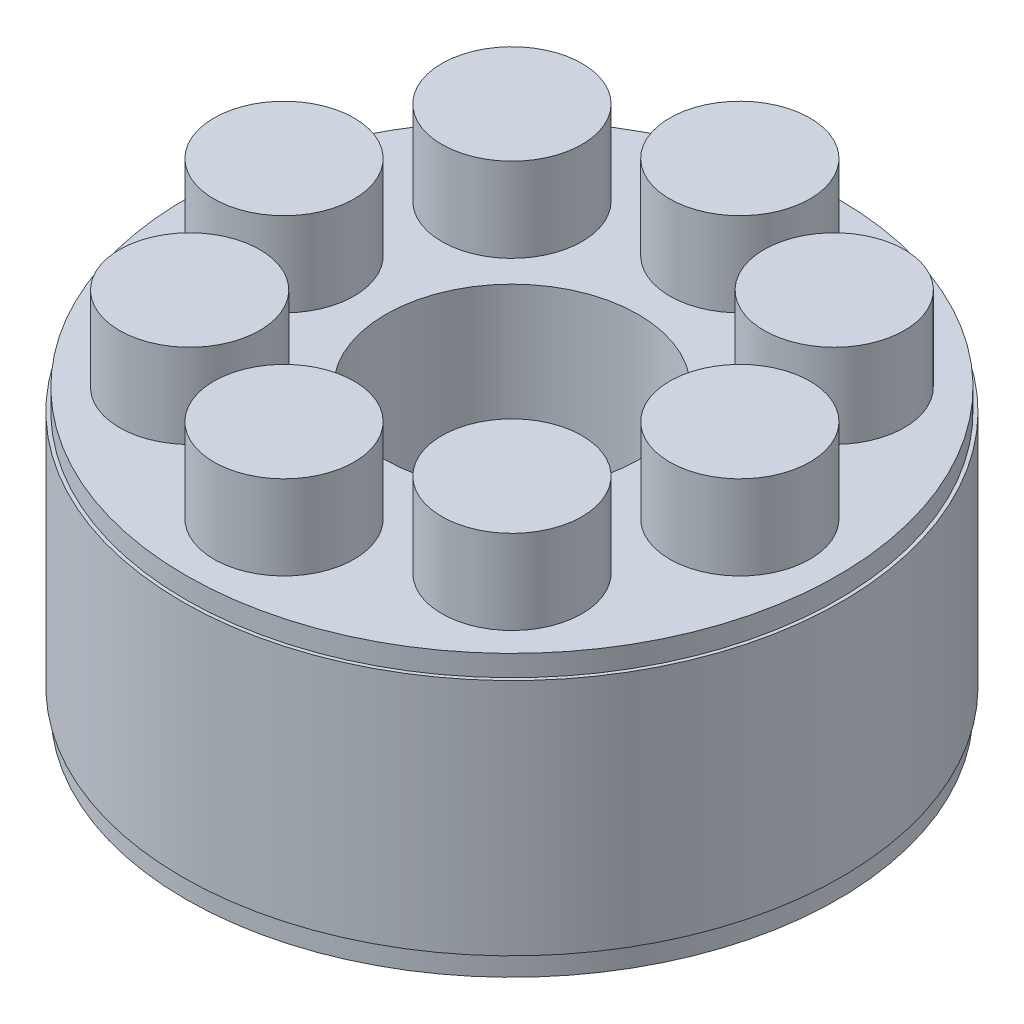
ISO-10303-21;
HEADER;
FILE_DESCRIPTION(('STEP AP214'),'2;1');
FILE_NAME('part.step','',(''),(''),'','','');
FILE_SCHEMA(('AUTOMOTIVE_DESIGN { 1 0 10303 214 1 1 1 1 }'));
ENDSEC;
DATA;
#1=APPLICATION_CONTEXT('core data for automotive mechanical design processes');
#2=APPLICATION_PROTOCOL_DEFINITION('international standard','automotive_design',2000,#1);
#3=PRODUCT_CONTEXT('',#1,'mechanical');
#4=PRODUCT('Part','Part','',(#3));
#5=PRODUCT_RELATED_PRODUCT_CATEGORY('part','',(#4));
#6=PRODUCT_DEFINITION_FORMATION('','',#4);
#7=PRODUCT_DEFINITION_CONTEXT('part definition',#1,'design');
#8=PRODUCT_DEFINITION('design','',#6,#7);
#9=PRODUCT_DEFINITION_SHAPE('','',#8);
#10=(LENGTH_UNIT() NAMED_UNIT(*) SI_UNIT(.MILLI.,.METRE.));
#11=(NAMED_UNIT(*) PLANE_ANGLE_UNIT() SI_UNIT($,.RADIAN.));
#12=(NAMED_UNIT(*) SI_UNIT($,.STERADIAN.) SOLID_ANGLE_UNIT());
#13=UNCERTAINTY_MEASURE_WITH_UNIT(LENGTH_MEASURE(1.E-05),#10,'distance_accuracy_value','');
#14=(GEOMETRIC_REPRESENTATION_CONTEXT(3) GLOBAL_UNCERTAINTY_ASSIGNED_CONTEXT((#13)) GLOBAL_UNIT_ASSIGNED_CONTEXT((#10,
#11,#12)) REPRESENTATION_CONTEXT('',''));
#15=CARTESIAN_POINT('',(0.,0.,0.));
#16=DIRECTION('',(0.,0.,1.));
#17=DIRECTION('',(1.,0.,0.));
#18=AXIS2_PLACEMENT_3D('',#15,#16,#17);
#19=CARTESIAN_POINT('',(0.,10.,0.));
#20=DIRECTION('',(0.,-1.,0.));
#21=DIRECTION('',(0.,0.,-1.));
#22=AXIS2_PLACEMENT_3D('',#19,#20,#21);
#23=CYLINDRICAL_SURFACE('',#22,23.25);
#24=CARTESIAN_POINT('',(0.,-10.,0.));
#25=DIRECTION('',(0.,1.,0.));
#26=DIRECTION('',(0.,0.,1.));
#27=AXIS2_PLACEMENT_3D('',#24,#25,#26);
#28=CIRCLE('',#27,23.25);
#29=CARTESIAN_POINT('',(0.,-10.,23.25));
#30=VERTEX_POINT('',#29);
#31=EDGE_CURVE('E47',#30,#30,#28,.T.);
#32=ORIENTED_EDGE('',*,*,#31,.T.);
#33=EDGE_LOOP('',(#32));
#34=FACE_BOUND('',#33,.T.);
#35=CARTESIAN_POINT('',(0.,-8.5,0.));
#36=DIRECTION('',(0.,1.,0.));
#37=DIRECTION('',(0.,0.,1.));
#38=AXIS2_PLACEMENT_3D('',#35,#36,#37);
#39=CIRCLE('',#38,23.25);
#40=CARTESIAN_POINT('',(0.,-8.5,23.25));
#41=VERTEX_POINT('',#40);
#42=EDGE_CURVE('E10',#41,#41,#39,.T.);
#43=ORIENTED_EDGE('',*,*,#42,.F.);
#44=EDGE_LOOP('',(#43));
#45=FACE_BOUND('',#44,.T.);
#46=ADVANCED_FACE('F43',(#34,#45),#23,.T.);
#47=CARTESIAN_POINT('',(0.,10.,0.));
#48=DIRECTION('',(0.,1.,0.));
#49=DIRECTION('',(0.,0.,1.));
#50=AXIS2_PLACEMENT_3D('',#47,#48,#49);
#51=PLANE('',#50);
#52=CARTESIAN_POINT('',(0.,10.,-16.25));
#53=DIRECTION('',(0.,1.,0.));
#54=DIRECTION('',(1.,0.,0.));
#55=AXIS2_PLACEMENT_3D('',#52,#53,#54);
#56=CIRCLE('',#55,5.);
#57=CARTESIAN_POINT('',(4.99999999999994,10.,-16.25));
#58=VERTEX_POINT('',#57);
#59=EDGE_CURVE('E89',#58,#58,#56,.T.);
#60=ORIENTED_EDGE('',*,*,#59,.F.);
#61=EDGE_LOOP('',(#60));
#62=FACE_BOUND('',#61,.T.);
#63=CARTESIAN_POINT('',(-11.4904851942815,10.,-11.4904851942813));
#64=DIRECTION('',(0.,1.,0.));
#65=DIRECTION('',(0.707106781186544,0.,-0.707106781186551));
#66=AXIS2_PLACEMENT_3D('',#63,#64,#65);
#67=CIRCLE('',#66,5.);
#68=CARTESIAN_POINT('',(-7.95495128834874,10.,-15.0260191002141));
#69=VERTEX_POINT('',#68);
#70=EDGE_CURVE('E97',#69,#69,#67,.T.);
#71=ORIENTED_EDGE('',*,*,#70,.F.);
#72=EDGE_LOOP('',(#71));
#73=FACE_BOUND('',#72,.T.);
#74=CARTESIAN_POINT('',(-16.25,10.,0.));
#75=DIRECTION('',(0.,1.,0.));
#76=DIRECTION('',(0.,0.,-1.));
#77=AXIS2_PLACEMENT_3D('',#74,#75,#76);
#78=CIRCLE('',#77,5.);
#79=CARTESIAN_POINT('',(-16.25,10.,-5.));
#80=VERTEX_POINT('',#79);
#81=EDGE_CURVE('E105',#80,#80,#78,.T.);
#82=ORIENTED_EDGE('',*,*,#81,.F.);
#83=EDGE_LOOP('',(#82));
#84=FACE_BOUND('',#83,.T.);
#85=CARTESIAN_POINT('',(-11.4904851942813,10.,11.4904851942815));
#86=DIRECTION('',(0.,1.,0.));
#87=DIRECTION('',(-0.707106781186554,0.,-0.707106781186541));
#88=AXIS2_PLACEMENT_3D('',#85,#86,#87);
#89=CIRCLE('',#88,5.);
#90=CARTESIAN_POINT('',(-15.0260191002141,10.,7.95495128834879));
#91=VERTEX_POINT('',#90);
#92=EDGE_CURVE('E72',#91,#91,#89,.T.);
#93=ORIENTED_EDGE('',*,*,#92,.F.);
#94=EDGE_LOOP('',(#93));
#95=FACE_BOUND('',#94,.T.);
#96=CARTESIAN_POINT('',(1.70209715268603E-13,10.,16.25));
#97=DIRECTION('',(0.,1.,0.));
#98=DIRECTION('',(-1.,0.,0.));
#99=AXIS2_PLACEMENT_3D('',#96,#97,#98);
#100=CIRCLE('',#99,5.);
#101=CARTESIAN_POINT('',(-4.99999999999983,10.,16.2500000000001));
#102=VERTEX_POINT('',#101);
#103=EDGE_CURVE('E73',#102,#102,#100,.T.);
#104=ORIENTED_EDGE('',*,*,#103,.F.);
#105=EDGE_LOOP('',(#104));
#106=FACE_BOUND('',#105,.T.);
#107=CARTESIAN_POINT('',(11.4904851942815,10.,11.4904851942813));
#108=DIRECTION('',(0.,1.,0.));
#109=DIRECTION('',(-0.707106781186539,0.,0.707106781186556));
#110=AXIS2_PLACEMENT_3D('',#107,#108,#109);
#111=CIRCLE('',#110,5.);
#112=CARTESIAN_POINT('',(7.95495128834884,10.,15.026019100214));
#113=VERTEX_POINT('',#112);
#114=EDGE_CURVE('E66',#113,#113,#111,.T.);
#115=ORIENTED_EDGE('',*,*,#114,.F.);
#116=EDGE_LOOP('',(#115));
#117=FACE_BOUND('',#116,.T.);
#118=CARTESIAN_POINT('',(11.4904851942814,10.,-11.4904851942814));
#119=DIRECTION('',(0.,1.,0.));
#120=DIRECTION('',(0.707106781186549,0.,0.707106781186546));
#121=AXIS2_PLACEMENT_3D('',#118,#119,#120);
#122=CIRCLE('',#121,5.);
#123=CARTESIAN_POINT('',(15.0260191002141,10.,-7.95495128834869));
#124=VERTEX_POINT('',#123);
#125=EDGE_CURVE('E88',#124,#124,#122,.T.);
#126=ORIENTED_EDGE('',*,*,#125,.F.);
#127=EDGE_LOOP('',(#126));
#128=FACE_BOUND('',#127,.T.);
#129=CARTESIAN_POINT('',(16.25,10.,0.));
#130=DIRECTION('',(0.,1.,0.));
#131=DIRECTION('',(0.,0.,1.));
#132=AXIS2_PLACEMENT_3D('',#129,#130,#131);
#133=CIRCLE('',#132,5.);
#134=CARTESIAN_POINT('',(16.25,10.,5.));
#135=VERTEX_POINT('',#134);
#136=EDGE_CURVE('E120',#135,#135,#133,.T.);
#137=ORIENTED_EDGE('',*,*,#136,.F.);
#138=EDGE_LOOP('',(#137));
#139=FACE_BOUND('',#138,.T.);
#140=CARTESIAN_POINT('',(0.,10.,0.));
#141=DIRECTION('',(0.,1.,0.));
#142=DIRECTION('',(0.,0.,1.));
#143=AXIS2_PLACEMENT_3D('',#140,#141,#142);
#144=CIRCLE('',#143,23.25);
#145=CARTESIAN_POINT('',(0.,10.,23.25));
#146=VERTEX_POINT('',#145);
#147=EDGE_CURVE('E52',#146,#146,#144,.T.);
#148=ORIENTED_EDGE('',*,*,#147,.T.);
#149=EDGE_LOOP('',(#148));
#150=FACE_BOUND('',#149,.T.);
#151=CARTESIAN_POINT('',(0.,10.,0.));
#152=DIRECTION('',(0.,1.,0.));
#153=DIRECTION('',(0.,0.,1.));
#154=AXIS2_PLACEMENT_3D('',#151,#152,#153);
#155=CIRCLE('',#154,9.);
#156=CARTESIAN_POINT('',(0.,10.,9.));
#157=VERTEX_POINT('',#156);
#158=EDGE_CURVE('E132',#157,#157,#155,.T.);
#159=ORIENTED_EDGE('',*,*,#158,.F.);
#160=EDGE_LOOP('',(#159));
#161=FACE_BOUND('',#160,.T.);
#162=ADVANCED_FACE('F158',(#62,#73,#84,#95,#106,#117,#128,#139,#150,#161),#51,.T.);
#163=CARTESIAN_POINT('',(0.,-10.,0.));
#164=DIRECTION('',(0.,1.,0.));
#165=DIRECTION('',(0.,0.,1.));
#166=AXIS2_PLACEMENT_3D('',#163,#164,#165);
#167=PLANE('',#166);
#168=ORIENTED_EDGE('',*,*,#31,.F.);
#169=EDGE_LOOP('',(#168));
#170=FACE_BOUND('',#169,.T.);
#171=CARTESIAN_POINT('',(0.,-10.,0.));
#172=DIRECTION('',(0.,1.,0.));
#173=DIRECTION('',(0.,0.,1.));
#174=AXIS2_PLACEMENT_3D('',#171,#172,#173);
#175=CIRCLE('',#174,9.);
#176=CARTESIAN_POINT('',(0.,-10.,9.));
#177=VERTEX_POINT('',#176);
#178=EDGE_CURVE('E128',#177,#177,#175,.T.);
#179=ORIENTED_EDGE('',*,*,#178,.T.);
#180=EDGE_LOOP('',(#179));
#181=FACE_BOUND('',#180,.T.);
#182=ADVANCED_FACE('F140',(#170,#181),#167,.F.);
#183=CARTESIAN_POINT('',(0.,8.5,0.));
#184=DIRECTION('',(0.,1.,0.));
#185=DIRECTION('',(0.,0.,1.));
#186=AXIS2_PLACEMENT_3D('',#183,#184,#185);
#187=CIRCLE('',#186,23.25);
#188=CARTESIAN_POINT('',(0.,8.5,23.25));
#189=VERTEX_POINT('',#188);
#190=EDGE_CURVE('E62',#189,#189,#187,.T.);
#191=ORIENTED_EDGE('',*,*,#190,.T.);
#192=EDGE_LOOP('',(#191));
#193=FACE_BOUND('',#192,.T.);
#194=ORIENTED_EDGE('',*,*,#147,.F.);
#195=EDGE_LOOP('',(#194));
#196=FACE_BOUND('',#195,.T.);
#197=ADVANCED_FACE('F45',(#193,#196),#23,.T.);
#198=CARTESIAN_POINT('',(0.,10.,0.));
#199=DIRECTION('',(0.,-1.,0.));
#200=DIRECTION('',(0.,0.,-1.));
#201=AXIS2_PLACEMENT_3D('',#198,#199,#200);
#202=CYLINDRICAL_SURFACE('',#201,9.);
#203=ORIENTED_EDGE('',*,*,#158,.T.);
#204=EDGE_LOOP('',(#203));
#205=FACE_BOUND('',#204,.T.);
#206=ORIENTED_EDGE('',*,*,#178,.F.);
#207=EDGE_LOOP('',(#206));
#208=FACE_BOUND('',#207,.T.);
#209=ADVANCED_FACE('F142',(#205,#208),#202,.F.);
#210=CARTESIAN_POINT('',(16.25,16.,0.));
#211=DIRECTION('',(0.,-1.,0.));
#212=DIRECTION('',(0.,0.,-1.));
#213=AXIS2_PLACEMENT_3D('',#210,#211,#212);
#214=CYLINDRICAL_SURFACE('',#213,5.);
#215=CARTESIAN_POINT('',(16.25,16.,0.));
#216=DIRECTION('',(0.,1.,0.));
#217=DIRECTION('',(0.,0.,1.));
#218=AXIS2_PLACEMENT_3D('',#215,#216,#217);
#219=CIRCLE('',#218,5.);
#220=CARTESIAN_POINT('',(16.25,16.,5.));
#221=VERTEX_POINT('',#220);
#222=EDGE_CURVE('E124',#221,#221,#219,.T.);
#223=ORIENTED_EDGE('',*,*,#222,.F.);
#224=EDGE_LOOP('',(#223));
#225=FACE_BOUND('',#224,.T.);
#226=ORIENTED_EDGE('',*,*,#136,.T.);
#227=EDGE_LOOP('',(#226));
#228=FACE_BOUND('',#227,.T.);
#229=ADVANCED_FACE('F144',(#225,#228),#214,.T.);
#230=CARTESIAN_POINT('',(16.25,16.,0.));
#231=DIRECTION('',(0.,1.,0.));
#232=DIRECTION('',(0.,0.,1.));
#233=AXIS2_PLACEMENT_3D('',#230,#231,#232);
#234=PLANE('',#233);
#235=ORIENTED_EDGE('',*,*,#222,.T.);
#236=EDGE_LOOP('',(#235));
#237=FACE_BOUND('',#236,.T.);
#238=ADVANCED_FACE('F152',(#237),#234,.T.);
#239=CARTESIAN_POINT('',(11.4904851942814,16.,-11.4904851942814));
#240=DIRECTION('',(0.,-1.,0.));
#241=DIRECTION('',(0.,0.,-1.));
#242=AXIS2_PLACEMENT_3D('',#239,#240,#241);
#243=CYLINDRICAL_SURFACE('',#242,5.);
#244=CARTESIAN_POINT('',(11.4904851942814,16.,-11.4904851942814));
#245=DIRECTION('',(0.,1.,0.));
#246=DIRECTION('',(0.707106781186549,0.,0.707106781186546));
#247=AXIS2_PLACEMENT_3D('',#244,#245,#246);
#248=CIRCLE('',#247,5.);
#249=CARTESIAN_POINT('',(15.0260191002141,16.,-7.95495128834869));
#250=VERTEX_POINT('',#249);
#251=EDGE_CURVE('E116',#250,#250,#248,.T.);
#252=ORIENTED_EDGE('',*,*,#251,.F.);
#253=EDGE_LOOP('',(#252));
#254=FACE_BOUND('',#253,.T.);
#255=ORIENTED_EDGE('',*,*,#125,.T.);
#256=EDGE_LOOP('',(#255));
#257=FACE_BOUND('',#256,.T.);
#258=ADVANCED_FACE('F186',(#254,#257),#243,.T.);
#259=CARTESIAN_POINT('',(11.4904851942814,16.,-11.4904851942814));
#260=DIRECTION('',(0.,1.,0.));
#261=DIRECTION('',(0.707106781186549,0.,0.707106781186546));
#262=AXIS2_PLACEMENT_3D('',#259,#260,#261);
#263=PLANE('',#262);
#264=ORIENTED_EDGE('',*,*,#251,.T.);
#265=EDGE_LOOP('',(#264));
#266=FACE_BOUND('',#265,.T.);
#267=ADVANCED_FACE('F200',(#266),#263,.T.);
#268=CARTESIAN_POINT('',(11.4904851942815,16.,11.4904851942813));
#269=DIRECTION('',(0.,-1.,0.));
#270=DIRECTION('',(0.,0.,-1.));
#271=AXIS2_PLACEMENT_3D('',#268,#269,#270);
#272=CYLINDRICAL_SURFACE('',#271,5.);
#273=CARTESIAN_POINT('',(11.4904851942815,16.,11.4904851942813));
#274=DIRECTION('',(0.,1.,0.));
#275=DIRECTION('',(-0.707106781186539,0.,0.707106781186556));
#276=AXIS2_PLACEMENT_3D('',#273,#274,#275);
#277=CIRCLE('',#276,5.);
#278=CARTESIAN_POINT('',(7.95495128834884,16.,15.026019100214));
#279=VERTEX_POINT('',#278);
#280=EDGE_CURVE('E77',#279,#279,#277,.T.);
#281=ORIENTED_EDGE('',*,*,#280,.F.);
#282=EDGE_LOOP('',(#281));
#283=FACE_BOUND('',#282,.T.);
#284=ORIENTED_EDGE('',*,*,#114,.T.);
#285=EDGE_LOOP('',(#284));
#286=FACE_BOUND('',#285,.T.);
#287=ADVANCED_FACE('F209',(#283,#286),#272,.T.);
#288=CARTESIAN_POINT('',(11.4904851942815,16.,11.4904851942813));
#289=DIRECTION('',(0.,1.,0.));
#290=DIRECTION('',(-0.707106781186539,0.,0.707106781186556));
#291=AXIS2_PLACEMENT_3D('',#288,#289,#290);
#292=PLANE('',#291);
#293=ORIENTED_EDGE('',*,*,#280,.T.);
#294=EDGE_LOOP('',(#293));
#295=FACE_BOUND('',#294,.T.);
#296=ADVANCED_FACE('F218',(#295),#292,.T.);
#297=CARTESIAN_POINT('',(1.70209715268603E-13,16.,16.25));
#298=DIRECTION('',(0.,-1.,0.));
#299=DIRECTION('',(0.,0.,-1.));
#300=AXIS2_PLACEMENT_3D('',#297,#298,#299);
#301=CYLINDRICAL_SURFACE('',#300,5.);
#302=CARTESIAN_POINT('',(1.70209715268603E-13,16.,16.25));
#303=DIRECTION('',(0.,1.,0.));
#304=DIRECTION('',(-1.,0.,0.));
#305=AXIS2_PLACEMENT_3D('',#302,#303,#304);
#306=CIRCLE('',#305,5.);
#307=CARTESIAN_POINT('',(-4.99999999999983,16.,16.2500000000001));
#308=VERTEX_POINT('',#307);
#309=EDGE_CURVE('E68',#308,#308,#306,.T.);
#310=ORIENTED_EDGE('',*,*,#309,.F.);
#311=EDGE_LOOP('',(#310));
#312=FACE_BOUND('',#311,.T.);
#313=ORIENTED_EDGE('',*,*,#103,.T.);
#314=EDGE_LOOP('',(#313));
#315=FACE_BOUND('',#314,.T.);
#316=ADVANCED_FACE('F227',(#312,#315),#301,.T.);
#317=CARTESIAN_POINT('',(1.70209715268603E-13,16.,16.25));
#318=DIRECTION('',(0.,1.,0.));
#319=DIRECTION('',(-1.,0.,0.));
#320=AXIS2_PLACEMENT_3D('',#317,#318,#319);
#321=PLANE('',#320);
#322=ORIENTED_EDGE('',*,*,#309,.T.);
#323=EDGE_LOOP('',(#322));
#324=FACE_BOUND('',#323,.T.);
#325=ADVANCED_FACE('F236',(#324),#321,.T.);
#326=CARTESIAN_POINT('',(-11.4904851942813,16.,11.4904851942815));
#327=DIRECTION('',(0.,-1.,0.));
#328=DIRECTION('',(0.,0.,-1.));
#329=AXIS2_PLACEMENT_3D('',#326,#327,#328);
#330=CYLINDRICAL_SURFACE('',#329,5.);
#331=CARTESIAN_POINT('',(-11.4904851942813,16.,11.4904851942815));
#332=DIRECTION('',(0.,1.,0.));
#333=DIRECTION('',(-0.707106781186554,0.,-0.707106781186541));
#334=AXIS2_PLACEMENT_3D('',#331,#332,#333);
#335=CIRCLE('',#334,5.);
#336=CARTESIAN_POINT('',(-15.0260191002141,16.,7.95495128834879));
#337=VERTEX_POINT('',#336);
#338=EDGE_CURVE('E109',#337,#337,#335,.T.);
#339=ORIENTED_EDGE('',*,*,#338,.F.);
#340=EDGE_LOOP('',(#339));
#341=FACE_BOUND('',#340,.T.);
#342=ORIENTED_EDGE('',*,*,#92,.T.);
#343=EDGE_LOOP('',(#342));
#344=FACE_BOUND('',#343,.T.);
#345=ADVANCED_FACE('F245',(#341,#344),#330,.T.);
#346=CARTESIAN_POINT('',(-11.4904851942813,16.,11.4904851942815));
#347=DIRECTION('',(0.,1.,0.));
#348=DIRECTION('',(-0.707106781186554,0.,-0.707106781186541));
#349=AXIS2_PLACEMENT_3D('',#346,#347,#348);
#350=PLANE('',#349);
#351=ORIENTED_EDGE('',*,*,#338,.T.);
#352=EDGE_LOOP('',(#351));
#353=FACE_BOUND('',#352,.T.);
#354=ADVANCED_FACE('F254',(#353),#350,.T.);
#355=CARTESIAN_POINT('',(-16.25,16.,0.));
#356=DIRECTION('',(0.,-1.,0.));
#357=DIRECTION('',(0.,0.,-1.));
#358=AXIS2_PLACEMENT_3D('',#355,#356,#357);
#359=CYLINDRICAL_SURFACE('',#358,5.);
#360=CARTESIAN_POINT('',(-16.25,16.,0.));
#361=DIRECTION('',(0.,1.,0.));
#362=DIRECTION('',(0.,0.,-1.));
#363=AXIS2_PLACEMENT_3D('',#360,#361,#362);
#364=CIRCLE('',#363,5.);
#365=CARTESIAN_POINT('',(-16.25,16.,-5.));
#366=VERTEX_POINT('',#365);
#367=EDGE_CURVE('E101',#366,#366,#364,.T.);
#368=ORIENTED_EDGE('',*,*,#367,.F.);
#369=EDGE_LOOP('',(#368));
#370=FACE_BOUND('',#369,.T.);
#371=ORIENTED_EDGE('',*,*,#81,.T.);
#372=EDGE_LOOP('',(#371));
#373=FACE_BOUND('',#372,.T.);
#374=ADVANCED_FACE('F263',(#370,#373),#359,.T.);
#375=CARTESIAN_POINT('',(-16.25,16.,0.));
#376=DIRECTION('',(0.,1.,0.));
#377=DIRECTION('',(0.,0.,-1.));
#378=AXIS2_PLACEMENT_3D('',#375,#376,#377);
#379=PLANE('',#378);
#380=ORIENTED_EDGE('',*,*,#367,.T.);
#381=EDGE_LOOP('',(#380));
#382=FACE_BOUND('',#381,.T.);
#383=ADVANCED_FACE('F272',(#382),#379,.T.);
#384=CARTESIAN_POINT('',(-11.4904851942815,16.,-11.4904851942813));
#385=DIRECTION('',(0.,-1.,0.));
#386=DIRECTION('',(0.,0.,-1.));
#387=AXIS2_PLACEMENT_3D('',#384,#385,#386);
#388=CYLINDRICAL_SURFACE('',#387,5.);
#389=CARTESIAN_POINT('',(-11.4904851942815,16.,-11.4904851942813));
#390=DIRECTION('',(0.,1.,0.));
#391=DIRECTION('',(0.707106781186544,0.,-0.707106781186551));
#392=AXIS2_PLACEMENT_3D('',#389,#390,#391);
#393=CIRCLE('',#392,5.);
#394=CARTESIAN_POINT('',(-7.95495128834874,16.,-15.0260191002141));
#395=VERTEX_POINT('',#394);
#396=EDGE_CURVE('E93',#395,#395,#393,.T.);
#397=ORIENTED_EDGE('',*,*,#396,.F.);
#398=EDGE_LOOP('',(#397));
#399=FACE_BOUND('',#398,.T.);
#400=ORIENTED_EDGE('',*,*,#70,.T.);
#401=EDGE_LOOP('',(#400));
#402=FACE_BOUND('',#401,.T.);
#403=ADVANCED_FACE('F281',(#399,#402),#388,.T.);
#404=CARTESIAN_POINT('',(-11.4904851942815,16.,-11.4904851942813));
#405=DIRECTION('',(0.,1.,0.));
#406=DIRECTION('',(0.707106781186544,0.,-0.707106781186551));
#407=AXIS2_PLACEMENT_3D('',#404,#405,#406);
#408=PLANE('',#407);
#409=ORIENTED_EDGE('',*,*,#396,.T.);
#410=EDGE_LOOP('',(#409));
#411=FACE_BOUND('',#410,.T.);
#412=ADVANCED_FACE('F290',(#411),#408,.T.);
#413=CARTESIAN_POINT('',(0.,16.,-16.25));
#414=DIRECTION('',(0.,-1.,0.));
#415=DIRECTION('',(0.,0.,-1.));
#416=AXIS2_PLACEMENT_3D('',#413,#414,#415);
#417=CYLINDRICAL_SURFACE('',#416,5.);
#418=CARTESIAN_POINT('',(0.,16.,-16.25));
#419=DIRECTION('',(0.,1.,0.));
#420=DIRECTION('',(1.,0.,0.));
#421=AXIS2_PLACEMENT_3D('',#418,#419,#420);
#422=CIRCLE('',#421,5.);
#423=CARTESIAN_POINT('',(4.99999999999994,16.,-16.25));
#424=VERTEX_POINT('',#423);
#425=EDGE_CURVE('E84',#424,#424,#422,.T.);
#426=ORIENTED_EDGE('',*,*,#425,.F.);
#427=EDGE_LOOP('',(#426));
#428=FACE_BOUND('',#427,.T.);
#429=ORIENTED_EDGE('',*,*,#59,.T.);
#430=EDGE_LOOP('',(#429));
#431=FACE_BOUND('',#430,.T.);
#432=ADVANCED_FACE('F299',(#428,#431),#417,.T.);
#433=CARTESIAN_POINT('',(0.,16.,-16.25));
#434=DIRECTION('',(0.,1.,0.));
#435=DIRECTION('',(1.,0.,0.));
#436=AXIS2_PLACEMENT_3D('',#433,#434,#435);
#437=PLANE('',#436);
#438=ORIENTED_EDGE('',*,*,#425,.T.);
#439=EDGE_LOOP('',(#438));
#440=FACE_BOUND('',#439,.T.);
#441=ADVANCED_FACE('F307',(#440),#437,.T.);
#442=CARTESIAN_POINT('',(0.,8.5,0.));
#443=DIRECTION('',(0.,1.,0.));
#444=DIRECTION('',(0.,0.,1.));
#445=AXIS2_PLACEMENT_3D('',#442,#443,#444);
#446=PLANE('',#445);
#447=CARTESIAN_POINT('',(0.,8.5,0.));
#448=DIRECTION('',(0.,1.,0.));
#449=DIRECTION('',(0.,0.,1.));
#450=AXIS2_PLACEMENT_3D('',#447,#448,#449);
#451=CIRCLE('',#450,23.5);
#452=CARTESIAN_POINT('',(0.,8.5,23.5));
#453=VERTEX_POINT('',#452);
#454=EDGE_CURVE('E67',#453,#453,#451,.T.);
#455=ORIENTED_EDGE('',*,*,#454,.T.);
#456=EDGE_LOOP('',(#455));
#457=FACE_BOUND('',#456,.T.);
#458=ORIENTED_EDGE('',*,*,#190,.F.);
#459=EDGE_LOOP('',(#458));
#460=FACE_BOUND('',#459,.T.);
#461=ADVANCED_FACE('F315',(#457,#460),#446,.T.);
#462=CARTESIAN_POINT('',(0.,-8.5,0.));
#463=DIRECTION('',(0.,1.,0.));
#464=DIRECTION('',(0.,0.,1.));
#465=AXIS2_PLACEMENT_3D('',#462,#463,#464);
#466=PLANE('',#465);
#467=CARTESIAN_POINT('',(0.,-8.5,0.));
#468=DIRECTION('',(0.,1.,0.));
#469=DIRECTION('',(0.,0.,1.));
#470=AXIS2_PLACEMENT_3D('',#467,#468,#469);
#471=CIRCLE('',#470,23.5);
#472=CARTESIAN_POINT('',(0.,-8.5,23.5));
#473=VERTEX_POINT('',#472);
#474=EDGE_CURVE('E60',#473,#473,#471,.T.);
#475=ORIENTED_EDGE('',*,*,#474,.F.);
#476=EDGE_LOOP('',(#475));
#477=FACE_BOUND('',#476,.T.);
#478=ORIENTED_EDGE('',*,*,#42,.T.);
#479=EDGE_LOOP('',(#478));
#480=FACE_BOUND('',#479,.T.);
#481=ADVANCED_FACE('F331',(#477,#480),#466,.F.);
#482=CARTESIAN_POINT('',(0.,8.5,0.));
#483=DIRECTION('',(0.,-1.,0.));
#484=DIRECTION('',(0.,0.,-1.));
#485=AXIS2_PLACEMENT_3D('',#482,#483,#484);
#486=CYLINDRICAL_SURFACE('',#485,23.5);
#487=ORIENTED_EDGE('',*,*,#454,.F.);
#488=EDGE_LOOP('',(#487));
#489=FACE_BOUND('',#488,.T.);
#490=ORIENTED_EDGE('',*,*,#474,.T.);
#491=EDGE_LOOP('',(#490));
#492=FACE_BOUND('',#491,.T.);
#493=ADVANCED_FACE('F341',(#489,#492),#486,.T.);
#494=CLOSED_SHELL('',(#46,#162,#182,#197,#209,#229,#238,#258,#267,#287,#296,#316,#325,#345,#354,
#374,#383,#403,#412,#432,#441,#461,#481,#493));
#495=MANIFOLD_SOLID_BREP('B2',#494);
#496=ADVANCED_BREP_SHAPE_REPRESENTATION('',(#18,#495),#14);
#497=SHAPE_DEFINITION_REPRESENTATION(#9,#496);
ENDSEC;
END-ISO-10303-21;
